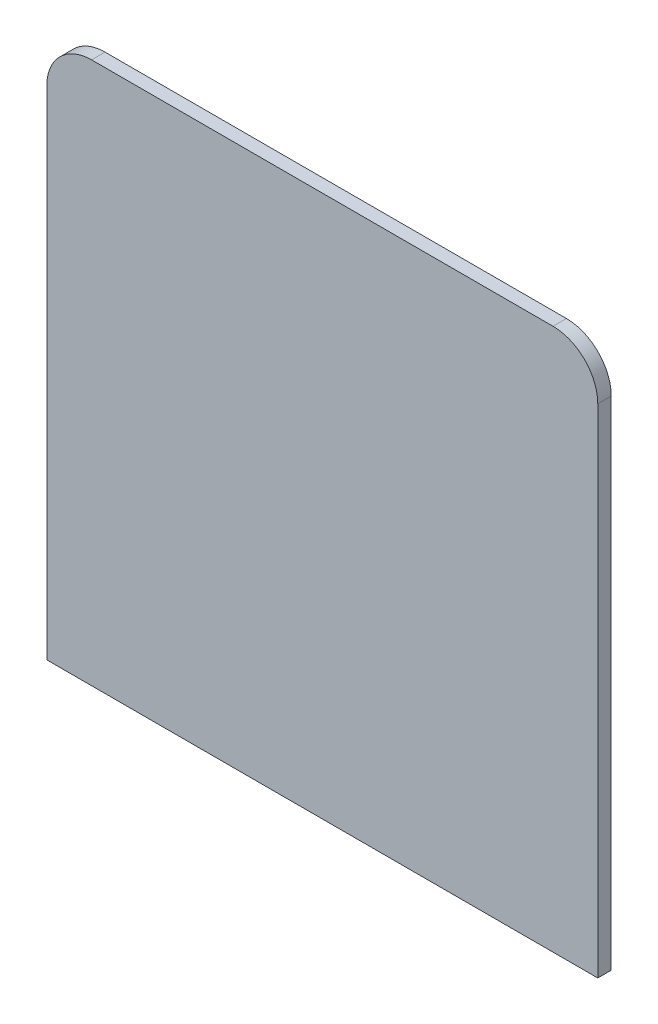
ISO-10303-21;
HEADER;
FILE_DESCRIPTION(('STEP AP214'),'2;1');
FILE_NAME('part.step','',(''),(''),'','','');
FILE_SCHEMA(('AUTOMOTIVE_DESIGN { 1 0 10303 214 1 1 1 1 }'));
ENDSEC;
DATA;
#1=APPLICATION_CONTEXT('core data for automotive mechanical design processes');
#2=APPLICATION_PROTOCOL_DEFINITION('international standard','automotive_design',2000,#1);
#3=PRODUCT_CONTEXT('',#1,'mechanical');
#4=PRODUCT('Part','Part','',(#3));
#5=PRODUCT_RELATED_PRODUCT_CATEGORY('part','',(#4));
#6=PRODUCT_DEFINITION_FORMATION('','',#4);
#7=PRODUCT_DEFINITION_CONTEXT('part definition',#1,'design');
#8=PRODUCT_DEFINITION('design','',#6,#7);
#9=PRODUCT_DEFINITION_SHAPE('','',#8);
#10=(LENGTH_UNIT() NAMED_UNIT(*) SI_UNIT(.MILLI.,.METRE.));
#11=(NAMED_UNIT(*) PLANE_ANGLE_UNIT() SI_UNIT($,.RADIAN.));
#12=(NAMED_UNIT(*) SI_UNIT($,.STERADIAN.) SOLID_ANGLE_UNIT());
#13=UNCERTAINTY_MEASURE_WITH_UNIT(LENGTH_MEASURE(1.E-05),#10,'distance_accuracy_value','');
#14=(GEOMETRIC_REPRESENTATION_CONTEXT(3) GLOBAL_UNCERTAINTY_ASSIGNED_CONTEXT((#13)) GLOBAL_UNIT_ASSIGNED_CONTEXT((#10,
#11,#12)) REPRESENTATION_CONTEXT('',''));
#15=CARTESIAN_POINT('',(0.,0.,0.));
#16=DIRECTION('',(0.,0.,1.));
#17=DIRECTION('',(1.,0.,0.));
#18=AXIS2_PLACEMENT_3D('',#15,#16,#17);
#19=CARTESIAN_POINT('',(-61.5,60.5,3.));
#20=DIRECTION('',(1.,0.,0.));
#21=DIRECTION('',(0.,1.,0.));
#22=AXIS2_PLACEMENT_3D('',#19,#20,#21);
#23=PLANE('',#22);
#24=DIRECTION('',(0.,-1.,0.));
#25=VECTOR('',#24,1.);
#26=CARTESIAN_POINT('',(-61.5,60.5,3.));
#27=LINE('',#26,#25);
#28=CARTESIAN_POINT('',(-61.5,50.5,3.));
#29=VERTEX_POINT('',#28);
#30=CARTESIAN_POINT('',(-61.5,-60.5,3.));
#31=VERTEX_POINT('',#30);
#32=EDGE_CURVE('E86',#29,#31,#27,.T.);
#33=ORIENTED_EDGE('',*,*,#32,.F.);
#34=DIRECTION('',(0.,0.,-1.));
#35=VECTOR('',#34,1.);
#36=CARTESIAN_POINT('',(-61.5,50.5,3.));
#37=LINE('',#36,#35);
#38=CARTESIAN_POINT('',(-61.5,50.5,0.));
#39=VERTEX_POINT('',#38);
#40=EDGE_CURVE('E11',#29,#39,#37,.T.);
#41=ORIENTED_EDGE('',*,*,#40,.T.);
#42=DIRECTION('',(0.,-1.,0.));
#43=VECTOR('',#42,1.);
#44=CARTESIAN_POINT('',(-61.5,60.5,0.));
#45=LINE('',#44,#43);
#46=CARTESIAN_POINT('',(-61.5,-60.5,0.));
#47=VERTEX_POINT('',#46);
#48=EDGE_CURVE('E105',#39,#47,#45,.T.);
#49=ORIENTED_EDGE('',*,*,#48,.T.);
#50=DIRECTION('',(0.,0.,-1.));
#51=VECTOR('',#50,1.);
#52=CARTESIAN_POINT('',(-61.5,-60.5,3.));
#53=LINE('',#52,#51);
#54=EDGE_CURVE('E99',#31,#47,#53,.T.);
#55=ORIENTED_EDGE('',*,*,#54,.F.);
#56=EDGE_LOOP('',(#33,#41,#49,#55));
#57=FACE_BOUND('',#56,.T.);
#58=ADVANCED_FACE('F33',(#57),#23,.F.);
#59=CARTESIAN_POINT('',(61.5,-60.5,3.));
#60=DIRECTION('',(0.,1.,0.));
#61=DIRECTION('',(-1.,0.,0.));
#62=AXIS2_PLACEMENT_3D('',#59,#60,#61);
#63=PLANE('',#62);
#64=DIRECTION('',(1.,0.,0.));
#65=VECTOR('',#64,1.);
#66=CARTESIAN_POINT('',(61.5,-60.5,0.));
#67=LINE('',#66,#65);
#68=CARTESIAN_POINT('',(61.5,-60.5,0.));
#69=VERTEX_POINT('',#68);
#70=EDGE_CURVE('E138',#47,#69,#67,.T.);
#71=ORIENTED_EDGE('',*,*,#70,.T.);
#72=DIRECTION('',(0.,0.,-1.));
#73=VECTOR('',#72,1.);
#74=CARTESIAN_POINT('',(61.5,-60.5,3.));
#75=LINE('',#74,#73);
#76=CARTESIAN_POINT('',(61.5,-60.5,3.));
#77=VERTEX_POINT('',#76);
#78=EDGE_CURVE('E101',#77,#69,#75,.T.);
#79=ORIENTED_EDGE('',*,*,#78,.F.);
#80=DIRECTION('',(1.,0.,0.));
#81=VECTOR('',#80,1.);
#82=CARTESIAN_POINT('',(61.5,-60.5,3.));
#83=LINE('',#82,#81);
#84=EDGE_CURVE('E89',#31,#77,#83,.T.);
#85=ORIENTED_EDGE('',*,*,#84,.F.);
#86=ORIENTED_EDGE('',*,*,#54,.T.);
#87=EDGE_LOOP('',(#71,#79,#85,#86));
#88=FACE_BOUND('',#87,.T.);
#89=ADVANCED_FACE('F98',(#88),#63,.F.);
#90=CARTESIAN_POINT('',(61.5,60.5,3.));
#91=DIRECTION('',(-1.,0.,0.));
#92=DIRECTION('',(0.,-1.,0.));
#93=AXIS2_PLACEMENT_3D('',#90,#91,#92);
#94=PLANE('',#93);
#95=DIRECTION('',(0.,1.,0.));
#96=VECTOR('',#95,1.);
#97=CARTESIAN_POINT('',(61.5,60.5,0.));
#98=LINE('',#97,#96);
#99=CARTESIAN_POINT('',(61.5,50.5,0.));
#100=VERTEX_POINT('',#99);
#101=EDGE_CURVE('E136',#69,#100,#98,.T.);
#102=ORIENTED_EDGE('',*,*,#101,.T.);
#103=DIRECTION('',(0.,0.,-1.));
#104=VECTOR('',#103,1.);
#105=CARTESIAN_POINT('',(61.5,50.5,3.));
#106=LINE('',#105,#104);
#107=CARTESIAN_POINT('',(61.5,50.5,3.));
#108=VERTEX_POINT('',#107);
#109=EDGE_CURVE('E56',#100,#108,#106,.F.);
#110=ORIENTED_EDGE('',*,*,#109,.T.);
#111=DIRECTION('',(0.,1.,0.));
#112=VECTOR('',#111,1.);
#113=CARTESIAN_POINT('',(61.5,60.5,3.));
#114=LINE('',#113,#112);
#115=EDGE_CURVE('E102',#77,#108,#114,.T.);
#116=ORIENTED_EDGE('',*,*,#115,.F.);
#117=ORIENTED_EDGE('',*,*,#78,.T.);
#118=EDGE_LOOP('',(#102,#110,#116,#117));
#119=FACE_BOUND('',#118,.T.);
#120=ADVANCED_FACE('F137',(#119),#94,.F.);
#121=CARTESIAN_POINT('',(61.5,60.5,3.));
#122=DIRECTION('',(0.,-1.,0.));
#123=DIRECTION('',(1.,0.,0.));
#124=AXIS2_PLACEMENT_3D('',#121,#122,#123);
#125=PLANE('',#124);
#126=DIRECTION('',(-1.,0.,0.));
#127=VECTOR('',#126,1.);
#128=CARTESIAN_POINT('',(61.5,60.5,3.));
#129=LINE('',#128,#127);
#130=CARTESIAN_POINT('',(51.5,60.5,3.));
#131=VERTEX_POINT('',#130);
#132=CARTESIAN_POINT('',(-51.5,60.5,3.));
#133=VERTEX_POINT('',#132);
#134=EDGE_CURVE('E111',#131,#133,#129,.T.);
#135=ORIENTED_EDGE('',*,*,#134,.F.);
#136=DIRECTION('',(0.,0.,-1.));
#137=VECTOR('',#136,1.);
#138=CARTESIAN_POINT('',(51.5,60.5,3.));
#139=LINE('',#138,#137);
#140=CARTESIAN_POINT('',(51.5,60.5,0.));
#141=VERTEX_POINT('',#140);
#142=EDGE_CURVE('E109',#131,#141,#139,.T.);
#143=ORIENTED_EDGE('',*,*,#142,.T.);
#144=DIRECTION('',(-1.,0.,0.));
#145=VECTOR('',#144,1.);
#146=CARTESIAN_POINT('',(61.5,60.5,0.));
#147=LINE('',#146,#145);
#148=CARTESIAN_POINT('',(-51.5,60.5,0.));
#149=VERTEX_POINT('',#148);
#150=EDGE_CURVE('E94',#141,#149,#147,.T.);
#151=ORIENTED_EDGE('',*,*,#150,.T.);
#152=DIRECTION('',(0.,0.,-1.));
#153=VECTOR('',#152,1.);
#154=CARTESIAN_POINT('',(-51.5,60.5,3.));
#155=LINE('',#154,#153);
#156=EDGE_CURVE('E107',#149,#133,#155,.F.);
#157=ORIENTED_EDGE('',*,*,#156,.T.);
#158=EDGE_LOOP('',(#135,#143,#151,#157));
#159=FACE_BOUND('',#158,.T.);
#160=ADVANCED_FACE('F127',(#159),#125,.F.);
#161=CARTESIAN_POINT('',(0.,0.,3.));
#162=DIRECTION('',(0.,0.,-1.));
#163=DIRECTION('',(-1.,0.,0.));
#164=AXIS2_PLACEMENT_3D('',#161,#162,#163);
#165=PLANE('',#164);
#166=ORIENTED_EDGE('',*,*,#115,.T.);
#167=CARTESIAN_POINT('',(51.5,50.5,3.));
#168=DIRECTION('',(0.,0.,-1.));
#169=DIRECTION('',(-1.,0.,0.));
#170=AXIS2_PLACEMENT_3D('',#167,#168,#169);
#171=CIRCLE('',#170,10.);
#172=EDGE_CURVE('E41',#108,#131,#171,.F.);
#173=ORIENTED_EDGE('',*,*,#172,.T.);
#174=ORIENTED_EDGE('',*,*,#134,.T.);
#175=CARTESIAN_POINT('',(-51.5,50.5,3.));
#176=DIRECTION('',(0.,0.,-1.));
#177=DIRECTION('',(-1.,0.,0.));
#178=AXIS2_PLACEMENT_3D('',#175,#176,#177);
#179=CIRCLE('',#178,10.);
#180=EDGE_CURVE('E48',#133,#29,#179,.F.);
#181=ORIENTED_EDGE('',*,*,#180,.T.);
#182=ORIENTED_EDGE('',*,*,#32,.T.);
#183=ORIENTED_EDGE('',*,*,#84,.T.);
#184=EDGE_LOOP('',(#166,#173,#174,#181,#182,#183));
#185=FACE_BOUND('',#184,.T.);
#186=ADVANCED_FACE('F88',(#185),#165,.F.);
#187=CARTESIAN_POINT('',(0.,0.,0.));
#188=DIRECTION('',(0.,0.,-1.));
#189=DIRECTION('',(-1.,0.,0.));
#190=AXIS2_PLACEMENT_3D('',#187,#188,#189);
#191=PLANE('',#190);
#192=ORIENTED_EDGE('',*,*,#150,.F.);
#193=CARTESIAN_POINT('',(51.5,50.5,0.));
#194=DIRECTION('',(0.,0.,-1.));
#195=DIRECTION('',(-1.,0.,0.));
#196=AXIS2_PLACEMENT_3D('',#193,#194,#195);
#197=CIRCLE('',#196,10.);
#198=EDGE_CURVE('E119',#141,#100,#197,.T.);
#199=ORIENTED_EDGE('',*,*,#198,.T.);
#200=ORIENTED_EDGE('',*,*,#101,.F.);
#201=ORIENTED_EDGE('',*,*,#70,.F.);
#202=ORIENTED_EDGE('',*,*,#48,.F.);
#203=CARTESIAN_POINT('',(-51.5,50.5,0.));
#204=DIRECTION('',(0.,0.,-1.));
#205=DIRECTION('',(-1.,0.,0.));
#206=AXIS2_PLACEMENT_3D('',#203,#204,#205);
#207=CIRCLE('',#206,10.);
#208=EDGE_CURVE('E117',#39,#149,#207,.T.);
#209=ORIENTED_EDGE('',*,*,#208,.T.);
#210=EDGE_LOOP('',(#192,#199,#200,#201,#202,#209));
#211=FACE_BOUND('',#210,.T.);
#212=ADVANCED_FACE('F135',(#211),#191,.T.);
#213=CARTESIAN_POINT('',(51.5,50.5,3.));
#214=DIRECTION('',(0.,0.,-1.));
#215=DIRECTION('',(-1.,0.,0.));
#216=AXIS2_PLACEMENT_3D('',#213,#214,#215);
#217=CYLINDRICAL_SURFACE('',#216,10.);
#218=ORIENTED_EDGE('',*,*,#172,.F.);
#219=ORIENTED_EDGE('',*,*,#109,.F.);
#220=ORIENTED_EDGE('',*,*,#198,.F.);
#221=ORIENTED_EDGE('',*,*,#142,.F.);
#222=EDGE_LOOP('',(#218,#219,#220,#221));
#223=FACE_BOUND('',#222,.T.);
#224=ADVANCED_FACE('F132',(#223),#217,.T.);
#225=CARTESIAN_POINT('',(-51.5,50.5,3.));
#226=DIRECTION('',(0.,0.,-1.));
#227=DIRECTION('',(-1.,0.,0.));
#228=AXIS2_PLACEMENT_3D('',#225,#226,#227);
#229=CYLINDRICAL_SURFACE('',#228,10.);
#230=ORIENTED_EDGE('',*,*,#180,.F.);
#231=ORIENTED_EDGE('',*,*,#156,.F.);
#232=ORIENTED_EDGE('',*,*,#208,.F.);
#233=ORIENTED_EDGE('',*,*,#40,.F.);
#234=EDGE_LOOP('',(#230,#231,#232,#233));
#235=FACE_BOUND('',#234,.T.);
#236=ADVANCED_FACE('F35',(#235),#229,.T.);
#237=CLOSED_SHELL('',(#58,#89,#120,#160,#186,#212,#224,#236));
#238=MANIFOLD_SOLID_BREP('B2',#237);
#239=ADVANCED_BREP_SHAPE_REPRESENTATION('',(#18,#238),#14);
#240=SHAPE_DEFINITION_REPRESENTATION(#9,#239);
ENDSEC;
END-ISO-10303-21;
